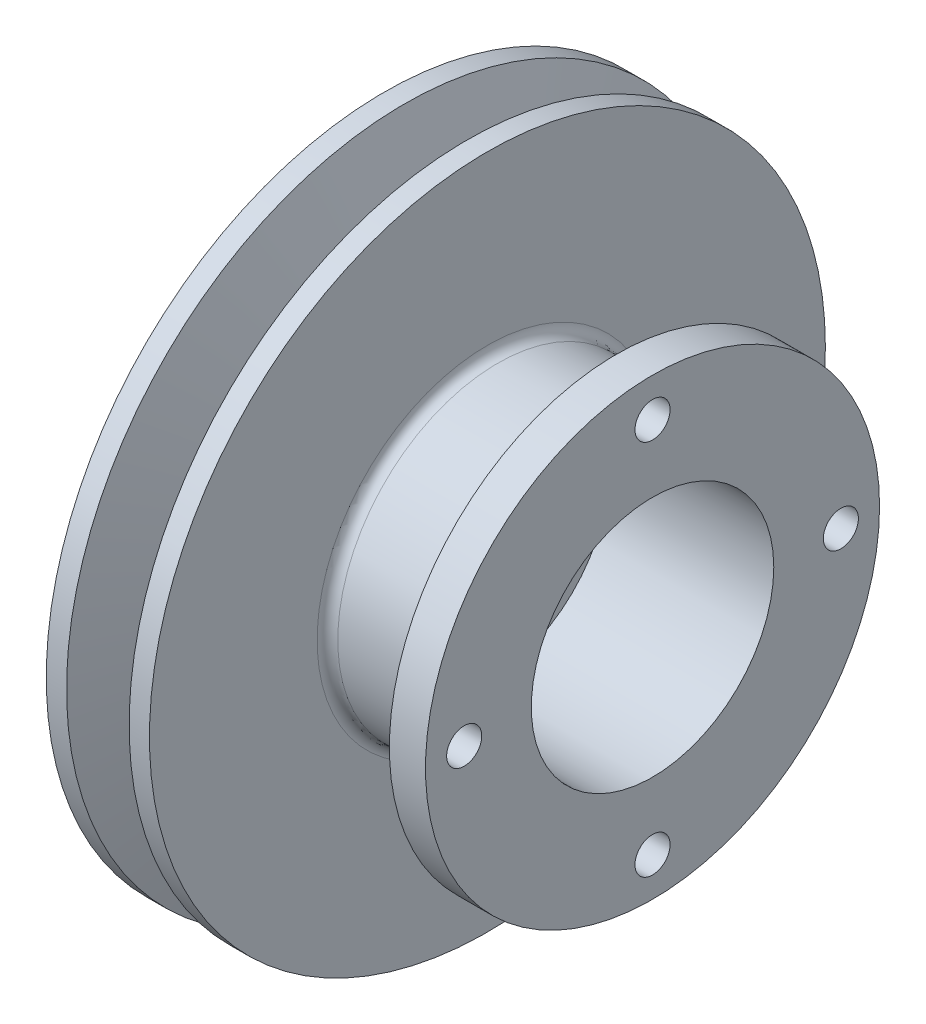
ISO-10303-21;
HEADER;
FILE_DESCRIPTION(('STEP AP214'),'2;1');
FILE_NAME('part.step','',(''),(''),'','','');
FILE_SCHEMA(('AUTOMOTIVE_DESIGN { 1 0 10303 214 1 1 1 1 }'));
ENDSEC;
DATA;
#1=APPLICATION_CONTEXT('core data for automotive mechanical design processes');
#2=APPLICATION_PROTOCOL_DEFINITION('international standard','automotive_design',2000,#1);
#3=PRODUCT_CONTEXT('',#1,'mechanical');
#4=PRODUCT('Part','Part','',(#3));
#5=PRODUCT_RELATED_PRODUCT_CATEGORY('part','',(#4));
#6=PRODUCT_DEFINITION_FORMATION('','',#4);
#7=PRODUCT_DEFINITION_CONTEXT('part definition',#1,'design');
#8=PRODUCT_DEFINITION('design','',#6,#7);
#9=PRODUCT_DEFINITION_SHAPE('','',#8);
#10=(LENGTH_UNIT() NAMED_UNIT(*) SI_UNIT(.MILLI.,.METRE.));
#11=(NAMED_UNIT(*) PLANE_ANGLE_UNIT() SI_UNIT($,.RADIAN.));
#12=(NAMED_UNIT(*) SI_UNIT($,.STERADIAN.) SOLID_ANGLE_UNIT());
#13=UNCERTAINTY_MEASURE_WITH_UNIT(LENGTH_MEASURE(1.E-05),#10,'distance_accuracy_value','');
#14=(GEOMETRIC_REPRESENTATION_CONTEXT(3) GLOBAL_UNCERTAINTY_ASSIGNED_CONTEXT((#13)) GLOBAL_UNIT_ASSIGNED_CONTEXT((#10,
#11,#12)) REPRESENTATION_CONTEXT('',''));
#15=CARTESIAN_POINT('',(0.,0.,0.));
#16=DIRECTION('',(0.,0.,1.));
#17=DIRECTION('',(1.,0.,0.));
#18=AXIS2_PLACEMENT_3D('',#15,#16,#17);
#19=CARTESIAN_POINT('',(-7.00000000000017,44.,0.));
#20=DIRECTION('',(-1.,0.,0.));
#21=DIRECTION('',(0.,0.,1.));
#22=AXIS2_PLACEMENT_3D('',#19,#20,#21);
#23=PLANE('',#22);
#24=CARTESIAN_POINT('',(-7.00000000000001,-36.5000000000001,0.));
#25=DIRECTION('',(-1.,0.,0.));
#26=DIRECTION('',(0.,0.,1.));
#27=AXIS2_PLACEMENT_3D('',#24,#25,#26);
#28=CIRCLE('',#27,3.4);
#29=CARTESIAN_POINT('',(-7.00000000000001,-36.5000000000001,3.40000000000007));
#30=VERTEX_POINT('',#29);
#31=EDGE_CURVE('E199',#30,#30,#28,.F.);
#32=ORIENTED_EDGE('',*,*,#31,.T.);
#33=EDGE_LOOP('',(#32));
#34=FACE_BOUND('',#33,.T.);
#35=CARTESIAN_POINT('',(-7.00000000000001,-1.31838984174237E-13,36.5));
#36=DIRECTION('',(-1.,0.,0.));
#37=DIRECTION('',(0.,0.,1.));
#38=AXIS2_PLACEMENT_3D('',#35,#36,#37);
#39=CIRCLE('',#38,3.39999999999999);
#40=CARTESIAN_POINT('',(-7.00000000000001,-1.31838984174237E-13,39.9));
#41=VERTEX_POINT('',#40);
#42=EDGE_CURVE('E191',#41,#41,#39,.F.);
#43=ORIENTED_EDGE('',*,*,#42,.T.);
#44=EDGE_LOOP('',(#43));
#45=FACE_BOUND('',#44,.T.);
#46=CARTESIAN_POINT('',(-7.00000000000001,0.,1.11022302462516E-13));
#47=DIRECTION('',(1.,0.,0.));
#48=DIRECTION('',(0.,0.,-1.));
#49=AXIS2_PLACEMENT_3D('',#46,#47,#48);
#50=CIRCLE('',#49,44.);
#51=CARTESIAN_POINT('',(-7.00000000000001,0.,-43.9999999999999));
#52=VERTEX_POINT('',#51);
#53=EDGE_CURVE('E113',#52,#52,#50,.T.);
#54=ORIENTED_EDGE('',*,*,#53,.F.);
#55=EDGE_LOOP('',(#54));
#56=FACE_BOUND('',#55,.T.);
#57=CARTESIAN_POINT('',(-7.00000000000001,0.,1.11022302462516E-13));
#58=DIRECTION('',(-1.,0.,0.));
#59=DIRECTION('',(0.,0.,1.));
#60=AXIS2_PLACEMENT_3D('',#57,#58,#59);
#61=CIRCLE('',#60,33.);
#62=CARTESIAN_POINT('',(-7.00000000000001,0.,33.0000000000001));
#63=VERTEX_POINT('',#62);
#64=EDGE_CURVE('E97',#63,#63,#61,.F.);
#65=ORIENTED_EDGE('',*,*,#64,.T.);
#66=EDGE_LOOP('',(#65));
#67=FACE_BOUND('',#66,.T.);
#68=CARTESIAN_POINT('',(-7.00000000000016,36.5,0.));
#69=DIRECTION('',(-1.,0.,0.));
#70=DIRECTION('',(0.,0.,1.));
#71=AXIS2_PLACEMENT_3D('',#68,#69,#70);
#72=CIRCLE('',#71,3.4);
#73=CARTESIAN_POINT('',(-7.00000000000016,36.5,3.40000000000002));
#74=VERTEX_POINT('',#73);
#75=EDGE_CURVE('E183',#74,#74,#72,.F.);
#76=ORIENTED_EDGE('',*,*,#75,.T.);
#77=EDGE_LOOP('',(#76));
#78=FACE_BOUND('',#77,.T.);
#79=CARTESIAN_POINT('',(-7.00000000000016,3.88578058618805E-13,-36.5));
#80=DIRECTION('',(-1.,0.,0.));
#81=DIRECTION('',(0.,0.,1.));
#82=AXIS2_PLACEMENT_3D('',#79,#80,#81);
#83=CIRCLE('',#82,3.39999999999999);
#84=CARTESIAN_POINT('',(-7.00000000000016,3.88578058618805E-13,-33.1));
#85=VERTEX_POINT('',#84);
#86=EDGE_CURVE('E207',#85,#85,#83,.F.);
#87=ORIENTED_EDGE('',*,*,#86,.T.);
#88=EDGE_LOOP('',(#87));
#89=FACE_BOUND('',#88,.T.);
#90=ADVANCED_FACE('F49',(#34,#45,#56,#67,#78,#89),#23,.T.);
#91=CARTESIAN_POINT('',(0.,0.,0.));
#92=DIRECTION('',(1.,0.,0.));
#93=DIRECTION('',(0.,0.,-1.));
#94=AXIS2_PLACEMENT_3D('',#91,#92,#93);
#95=PLANE('',#94);
#96=CARTESIAN_POINT('',(-1.52655665885959E-13,3.81639164714898E-13,-36.5));
#97=DIRECTION('',(1.,0.,0.));
#98=DIRECTION('',(0.,0.,-1.));
#99=AXIS2_PLACEMENT_3D('',#96,#97,#98);
#100=CIRCLE('',#99,3.39999999999999);
#101=CARTESIAN_POINT('',(-1.52655665885959E-13,3.81639164714898E-13,-39.9));
#102=VERTEX_POINT('',#101);
#103=EDGE_CURVE('E211',#102,#102,#100,.T.);
#104=ORIENTED_EDGE('',*,*,#103,.F.);
#105=EDGE_LOOP('',(#104));
#106=FACE_BOUND('',#105,.T.);
#107=CARTESIAN_POINT('',(0.,-36.5,0.));
#108=DIRECTION('',(1.,0.,0.));
#109=DIRECTION('',(0.,0.,-1.));
#110=AXIS2_PLACEMENT_3D('',#107,#108,#109);
#111=CIRCLE('',#110,3.39999999999999);
#112=CARTESIAN_POINT('',(0.,-36.5,-3.39999999999999));
#113=VERTEX_POINT('',#112);
#114=EDGE_CURVE('E203',#113,#113,#111,.T.);
#115=ORIENTED_EDGE('',*,*,#114,.F.);
#116=EDGE_LOOP('',(#115));
#117=FACE_BOUND('',#116,.T.);
#118=CARTESIAN_POINT('',(0.,-1.2490009027033E-13,36.5));
#119=DIRECTION('',(1.,0.,0.));
#120=DIRECTION('',(0.,0.,-1.));
#121=AXIS2_PLACEMENT_3D('',#118,#119,#120);
#122=CIRCLE('',#121,3.39999999999999);
#123=CARTESIAN_POINT('',(0.,-1.2490009027033E-13,33.1));
#124=VERTEX_POINT('',#123);
#125=EDGE_CURVE('E195',#124,#124,#122,.T.);
#126=ORIENTED_EDGE('',*,*,#125,.F.);
#127=EDGE_LOOP('',(#126));
#128=FACE_BOUND('',#127,.T.);
#129=CARTESIAN_POINT('',(-1.52655665885959E-13,36.5,0.));
#130=DIRECTION('',(1.,0.,0.));
#131=DIRECTION('',(0.,0.,-1.));
#132=AXIS2_PLACEMENT_3D('',#129,#130,#131);
#133=CIRCLE('',#132,3.39999999999999);
#134=CARTESIAN_POINT('',(-1.52655665885959E-13,36.5,-3.39999999999994));
#135=VERTEX_POINT('',#134);
#136=EDGE_CURVE('E187',#135,#135,#133,.T.);
#137=ORIENTED_EDGE('',*,*,#136,.F.);
#138=EDGE_LOOP('',(#137));
#139=FACE_BOUND('',#138,.T.);
#140=CARTESIAN_POINT('',(0.,0.,0.));
#141=DIRECTION('',(1.,0.,0.));
#142=DIRECTION('',(0.,0.,-1.));
#143=AXIS2_PLACEMENT_3D('',#140,#141,#142);
#144=CIRCLE('',#143,23.5);
#145=CARTESIAN_POINT('',(0.,0.,-23.5));
#146=VERTEX_POINT('',#145);
#147=EDGE_CURVE('E143',#146,#146,#144,.T.);
#148=ORIENTED_EDGE('',*,*,#147,.F.);
#149=EDGE_LOOP('',(#148));
#150=FACE_BOUND('',#149,.T.);
#151=CARTESIAN_POINT('',(0.,0.,0.));
#152=DIRECTION('',(1.,0.,0.));
#153=DIRECTION('',(0.,0.,-1.));
#154=AXIS2_PLACEMENT_3D('',#151,#152,#153);
#155=CIRCLE('',#154,44.);
#156=CARTESIAN_POINT('',(0.,0.,-44.));
#157=VERTEX_POINT('',#156);
#158=EDGE_CURVE('E109',#157,#157,#155,.T.);
#159=ORIENTED_EDGE('',*,*,#158,.T.);
#160=EDGE_LOOP('',(#159));
#161=FACE_BOUND('',#160,.T.);
#162=ADVANCED_FACE('F219',(#106,#117,#128,#139,#150,#161),#95,.T.);
#163=CARTESIAN_POINT('',(0.,0.,0.));
#164=DIRECTION('',(1.,0.,0.));
#165=DIRECTION('',(0.,0.,-1.));
#166=AXIS2_PLACEMENT_3D('',#163,#164,#165);
#167=CYLINDRICAL_SURFACE('',#166,44.);
#168=ORIENTED_EDGE('',*,*,#53,.T.);
#169=EDGE_LOOP('',(#168));
#170=FACE_BOUND('',#169,.T.);
#171=ORIENTED_EDGE('',*,*,#158,.F.);
#172=EDGE_LOOP('',(#171));
#173=FACE_BOUND('',#172,.T.);
#174=ADVANCED_FACE('F222',(#170,#173),#167,.T.);
#175=CARTESIAN_POINT('',(0.,0.,0.));
#176=DIRECTION('',(1.,0.,0.));
#177=DIRECTION('',(0.,0.,-1.));
#178=AXIS2_PLACEMENT_3D('',#175,#176,#177);
#179=CYLINDRICAL_SURFACE('',#178,31.);
#180=CARTESIAN_POINT('',(-8.99999999999999,0.,0.));
#181=DIRECTION('',(-1.,0.,0.));
#182=DIRECTION('',(0.,0.,1.));
#183=AXIS2_PLACEMENT_3D('',#180,#181,#182);
#184=CIRCLE('',#183,31.);
#185=CARTESIAN_POINT('',(-8.99999999999999,0.,31.));
#186=VERTEX_POINT('',#185);
#187=EDGE_CURVE('E89',#186,#186,#184,.T.);
#188=ORIENTED_EDGE('',*,*,#187,.T.);
#189=EDGE_LOOP('',(#188));
#190=FACE_BOUND('',#189,.T.);
#191=CARTESIAN_POINT('',(-30.0000000000001,0.,0.));
#192=DIRECTION('',(1.,0.,0.));
#193=DIRECTION('',(0.,0.,-1.));
#194=AXIS2_PLACEMENT_3D('',#191,#192,#193);
#195=CIRCLE('',#194,31.);
#196=CARTESIAN_POINT('',(-30.0000000000001,0.,-30.9999999999999));
#197=VERTEX_POINT('',#196);
#198=EDGE_CURVE('E93',#197,#197,#195,.T.);
#199=ORIENTED_EDGE('',*,*,#198,.T.);
#200=EDGE_LOOP('',(#199));
#201=FACE_BOUND('',#200,.T.);
#202=ADVANCED_FACE('F235',(#190,#201),#179,.T.);
#203=CARTESIAN_POINT('',(-32.0000000000001,31.,0.));
#204=DIRECTION('',(1.,0.,0.));
#205=DIRECTION('',(0.,0.,-1.));
#206=AXIS2_PLACEMENT_3D('',#203,#204,#205);
#207=PLANE('',#206);
#208=CARTESIAN_POINT('',(-32.0000000000001,0.,0.));
#209=DIRECTION('',(1.,0.,0.));
#210=DIRECTION('',(0.,0.,-1.));
#211=AXIS2_PLACEMENT_3D('',#208,#209,#210);
#212=CIRCLE('',#211,33.);
#213=CARTESIAN_POINT('',(-32.0000000000001,0.,-33.));
#214=VERTEX_POINT('',#213);
#215=EDGE_CURVE('E85',#214,#214,#212,.F.);
#216=ORIENTED_EDGE('',*,*,#215,.T.);
#217=EDGE_LOOP('',(#216));
#218=FACE_BOUND('',#217,.T.);
#219=CARTESIAN_POINT('',(-32.0000000000001,0.,0.));
#220=DIRECTION('',(1.,0.,0.));
#221=DIRECTION('',(0.,0.,-1.));
#222=AXIS2_PLACEMENT_3D('',#219,#220,#221);
#223=CIRCLE('',#222,65.5);
#224=CARTESIAN_POINT('',(-32.0000000000001,0.,-65.5));
#225=VERTEX_POINT('',#224);
#226=EDGE_CURVE('E116',#225,#225,#223,.T.);
#227=ORIENTED_EDGE('',*,*,#226,.T.);
#228=EDGE_LOOP('',(#227));
#229=FACE_BOUND('',#228,.T.);
#230=ADVANCED_FACE('F242',(#218,#229),#207,.T.);
#231=CARTESIAN_POINT('',(0.,0.,0.));
#232=DIRECTION('',(1.,0.,0.));
#233=DIRECTION('',(0.,0.,-1.));
#234=AXIS2_PLACEMENT_3D('',#231,#232,#233);
#235=CYLINDRICAL_SURFACE('',#234,65.5);
#236=CARTESIAN_POINT('',(-35.937861366952,0.,0.));
#237=DIRECTION('',(1.,0.,0.));
#238=DIRECTION('',(0.,0.,-1.));
#239=AXIS2_PLACEMENT_3D('',#236,#237,#238);
#240=CIRCLE('',#239,65.5);
#241=CARTESIAN_POINT('',(-35.937861366952,0.,-65.4999999999999));
#242=VERTEX_POINT('',#241);
#243=EDGE_CURVE('E119',#242,#242,#240,.T.);
#244=ORIENTED_EDGE('',*,*,#243,.T.);
#245=EDGE_LOOP('',(#244));
#246=FACE_BOUND('',#245,.T.);
#247=ORIENTED_EDGE('',*,*,#226,.F.);
#248=EDGE_LOOP('',(#247));
#249=FACE_BOUND('',#248,.T.);
#250=ADVANCED_FACE('F253',(#246,#249),#235,.T.);
#251=CARTESIAN_POINT('',(-35.937861366952,0.,0.));
#252=DIRECTION('',(1.,0.,0.));
#253=DIRECTION('',(0.,0.,-1.));
#254=AXIS2_PLACEMENT_3D('',#251,#252,#253);
#255=CONICAL_SURFACE('',#254,65.5,1.25663706143592);
#256=CARTESIAN_POINT('',(-39.9993575698633,0.,1.11022302462516E-13));
#257=DIRECTION('',(1.,0.,0.));
#258=DIRECTION('',(0.,0.,-1.));
#259=AXIS2_PLACEMENT_3D('',#256,#257,#258);
#260=CIRCLE('',#259,53.);
#261=CARTESIAN_POINT('',(-39.9993575698633,0.,-52.9999999999999));
#262=VERTEX_POINT('',#261);
#263=EDGE_CURVE('E123',#262,#262,#260,.T.);
#264=ORIENTED_EDGE('',*,*,#263,.T.);
#265=EDGE_LOOP('',(#264));
#266=FACE_BOUND('',#265,.T.);
#267=ORIENTED_EDGE('',*,*,#243,.F.);
#268=EDGE_LOOP('',(#267));
#269=FACE_BOUND('',#268,.T.);
#270=ADVANCED_FACE('F257',(#266,#269),#255,.T.);
#271=CARTESIAN_POINT('',(0.,0.,0.));
#272=DIRECTION('',(1.,0.,0.));
#273=DIRECTION('',(0.,0.,-1.));
#274=AXIS2_PLACEMENT_3D('',#271,#272,#273);
#275=CYLINDRICAL_SURFACE('',#274,53.);
#276=CARTESIAN_POINT('',(-44.0006424301369,0.,0.));
#277=DIRECTION('',(1.,0.,0.));
#278=DIRECTION('',(0.,0.,-1.));
#279=AXIS2_PLACEMENT_3D('',#276,#277,#278);
#280=CIRCLE('',#279,53.);
#281=CARTESIAN_POINT('',(-44.0006424301369,0.,-53.));
#282=VERTEX_POINT('',#281);
#283=EDGE_CURVE('E127',#282,#282,#280,.T.);
#284=ORIENTED_EDGE('',*,*,#283,.T.);
#285=EDGE_LOOP('',(#284));
#286=FACE_BOUND('',#285,.T.);
#287=ORIENTED_EDGE('',*,*,#263,.F.);
#288=EDGE_LOOP('',(#287));
#289=FACE_BOUND('',#288,.T.);
#290=ADVANCED_FACE('F261',(#286,#289),#275,.T.);
#291=CARTESIAN_POINT('',(-44.0006424301369,0.,0.));
#292=DIRECTION('',(-1.,0.,0.));
#293=DIRECTION('',(0.,0.,1.));
#294=AXIS2_PLACEMENT_3D('',#291,#292,#293);
#295=CONICAL_SURFACE('',#294,53.,1.25663706143592);
#296=CARTESIAN_POINT('',(-48.0621386330481,0.,0.));
#297=DIRECTION('',(1.,0.,0.));
#298=DIRECTION('',(0.,0.,-1.));
#299=AXIS2_PLACEMENT_3D('',#296,#297,#298);
#300=CIRCLE('',#299,65.5);
#301=CARTESIAN_POINT('',(-48.0621386330481,0.,-65.4999999999999));
#302=VERTEX_POINT('',#301);
#303=EDGE_CURVE('E131',#302,#302,#300,.T.);
#304=ORIENTED_EDGE('',*,*,#303,.T.);
#305=EDGE_LOOP('',(#304));
#306=FACE_BOUND('',#305,.T.);
#307=ORIENTED_EDGE('',*,*,#283,.F.);
#308=EDGE_LOOP('',(#307));
#309=FACE_BOUND('',#308,.T.);
#310=ADVANCED_FACE('F265',(#306,#309),#295,.T.);
#311=CARTESIAN_POINT('',(0.,0.,0.));
#312=DIRECTION('',(1.,0.,0.));
#313=DIRECTION('',(0.,0.,-1.));
#314=AXIS2_PLACEMENT_3D('',#311,#312,#313);
#315=CYLINDRICAL_SURFACE('',#314,65.5);
#316=CARTESIAN_POINT('',(-52.0000000000001,0.,0.));
#317=DIRECTION('',(1.,0.,0.));
#318=DIRECTION('',(0.,0.,-1.));
#319=AXIS2_PLACEMENT_3D('',#316,#317,#318);
#320=CIRCLE('',#319,65.5);
#321=CARTESIAN_POINT('',(-52.0000000000001,0.,-65.5));
#322=VERTEX_POINT('',#321);
#323=EDGE_CURVE('E135',#322,#322,#320,.T.);
#324=ORIENTED_EDGE('',*,*,#323,.T.);
#325=EDGE_LOOP('',(#324));
#326=FACE_BOUND('',#325,.T.);
#327=ORIENTED_EDGE('',*,*,#303,.F.);
#328=EDGE_LOOP('',(#327));
#329=FACE_BOUND('',#328,.T.);
#330=ADVANCED_FACE('F269',(#326,#329),#315,.T.);
#331=CARTESIAN_POINT('',(-52.,65.5,0.));
#332=DIRECTION('',(-1.,0.,0.));
#333=DIRECTION('',(0.,0.,1.));
#334=AXIS2_PLACEMENT_3D('',#331,#332,#333);
#335=PLANE('',#334);
#336=CARTESIAN_POINT('',(-52.0000000000001,0.,0.));
#337=DIRECTION('',(-1.,0.,0.));
#338=DIRECTION('',(0.,0.,1.));
#339=AXIS2_PLACEMENT_3D('',#336,#337,#338);
#340=CIRCLE('',#339,48.);
#341=CARTESIAN_POINT('',(-52.0000000000001,0.,48.));
#342=VERTEX_POINT('',#341);
#343=EDGE_CURVE('E81',#342,#342,#340,.F.);
#344=ORIENTED_EDGE('',*,*,#343,.T.);
#345=EDGE_LOOP('',(#344));
#346=FACE_BOUND('',#345,.T.);
#347=ORIENTED_EDGE('',*,*,#323,.F.);
#348=EDGE_LOOP('',(#347));
#349=FACE_BOUND('',#348,.T.);
#350=ADVANCED_FACE('F273',(#346,#349),#335,.T.);
#351=CARTESIAN_POINT('',(0.,0.,0.));
#352=DIRECTION('',(1.,0.,0.));
#353=DIRECTION('',(0.,0.,-1.));
#354=AXIS2_PLACEMENT_3D('',#351,#352,#353);
#355=CYLINDRICAL_SURFACE('',#354,46.);
#356=CARTESIAN_POINT('',(-50.0000000000001,0.,0.));
#357=DIRECTION('',(-1.,0.,0.));
#358=DIRECTION('',(0.,0.,1.));
#359=AXIS2_PLACEMENT_3D('',#356,#357,#358);
#360=CIRCLE('',#359,46.);
#361=CARTESIAN_POINT('',(-50.0000000000001,0.,46.0000000000001));
#362=VERTEX_POINT('',#361);
#363=EDGE_CURVE('E71',#362,#362,#360,.T.);
#364=ORIENTED_EDGE('',*,*,#363,.T.);
#365=EDGE_LOOP('',(#364));
#366=FACE_BOUND('',#365,.T.);
#367=CARTESIAN_POINT('',(-41.0000000000001,0.,0.));
#368=DIRECTION('',(-1.,0.,0.));
#369=DIRECTION('',(0.,0.,1.));
#370=AXIS2_PLACEMENT_3D('',#367,#368,#369);
#371=CIRCLE('',#370,46.);
#372=CARTESIAN_POINT('',(-41.0000000000001,0.,46.));
#373=VERTEX_POINT('',#372);
#374=EDGE_CURVE('E77',#373,#373,#371,.F.);
#375=ORIENTED_EDGE('',*,*,#374,.T.);
#376=EDGE_LOOP('',(#375));
#377=FACE_BOUND('',#376,.T.);
#378=ADVANCED_FACE('F277',(#366,#377),#355,.F.);
#379=CARTESIAN_POINT('',(-39.0000000000001,46.,0.));
#380=DIRECTION('',(-1.,0.,0.));
#381=DIRECTION('',(0.,0.,1.));
#382=AXIS2_PLACEMENT_3D('',#379,#380,#381);
#383=PLANE('',#382);
#384=CARTESIAN_POINT('',(-39.0000000000001,0.,0.));
#385=DIRECTION('',(-1.,0.,0.));
#386=DIRECTION('',(0.,0.,1.));
#387=AXIS2_PLACEMENT_3D('',#384,#385,#386);
#388=CIRCLE('',#387,40.);
#389=CARTESIAN_POINT('',(-39.0000000000001,0.,40.0000000000001));
#390=VERTEX_POINT('',#389);
#391=EDGE_CURVE('E57',#390,#390,#388,.F.);
#392=ORIENTED_EDGE('',*,*,#391,.T.);
#393=EDGE_LOOP('',(#392));
#394=FACE_BOUND('',#393,.T.);
#395=CARTESIAN_POINT('',(-39.0000000000001,0.,0.));
#396=DIRECTION('',(-1.,0.,0.));
#397=DIRECTION('',(0.,0.,1.));
#398=AXIS2_PLACEMENT_3D('',#395,#396,#397);
#399=CIRCLE('',#398,44.);
#400=CARTESIAN_POINT('',(-39.0000000000001,0.,44.0000000000001));
#401=VERTEX_POINT('',#400);
#402=EDGE_CURVE('E64',#401,#401,#399,.T.);
#403=ORIENTED_EDGE('',*,*,#402,.T.);
#404=EDGE_LOOP('',(#403));
#405=FACE_BOUND('',#404,.T.);
#406=ADVANCED_FACE('F281',(#394,#405),#383,.T.);
#407=CARTESIAN_POINT('',(0.,0.,0.));
#408=DIRECTION('',(1.,0.,0.));
#409=DIRECTION('',(0.,0.,-1.));
#410=AXIS2_PLACEMENT_3D('',#407,#408,#409);
#411=CYLINDRICAL_SURFACE('',#410,38.);
#412=CARTESIAN_POINT('',(-41.0000000000001,0.,0.));
#413=DIRECTION('',(-1.,0.,0.));
#414=DIRECTION('',(0.,0.,1.));
#415=AXIS2_PLACEMENT_3D('',#412,#413,#414);
#416=CIRCLE('',#415,38.);
#417=CARTESIAN_POINT('',(-41.0000000000001,0.,38.));
#418=VERTEX_POINT('',#417);
#419=EDGE_CURVE('E10',#418,#418,#416,.T.);
#420=ORIENTED_EDGE('',*,*,#419,.T.);
#421=EDGE_LOOP('',(#420));
#422=FACE_BOUND('',#421,.T.);
#423=CARTESIAN_POINT('',(-66.,0.,0.));
#424=DIRECTION('',(1.,0.,0.));
#425=DIRECTION('',(0.,0.,-1.));
#426=AXIS2_PLACEMENT_3D('',#423,#424,#425);
#427=CIRCLE('',#426,38.);
#428=CARTESIAN_POINT('',(-66.,0.,-37.9999999999999));
#429=VERTEX_POINT('',#428);
#430=EDGE_CURVE('E139',#429,#429,#427,.T.);
#431=ORIENTED_EDGE('',*,*,#430,.T.);
#432=EDGE_LOOP('',(#431));
#433=FACE_BOUND('',#432,.T.);
#434=ADVANCED_FACE('F285',(#422,#433),#411,.T.);
#435=CARTESIAN_POINT('',(-66.0000000000002,38.,0.));
#436=DIRECTION('',(-1.,0.,0.));
#437=DIRECTION('',(0.,0.,1.));
#438=AXIS2_PLACEMENT_3D('',#435,#436,#437);
#439=PLANE('',#438);
#440=CARTESIAN_POINT('',(-66.,0.,0.));
#441=DIRECTION('',(1.,0.,0.));
#442=DIRECTION('',(0.,0.,-1.));
#443=AXIS2_PLACEMENT_3D('',#440,#441,#442);
#444=CIRCLE('',#443,30.);
#445=CARTESIAN_POINT('',(-66.,0.,-29.9999999999999));
#446=VERTEX_POINT('',#445);
#447=EDGE_CURVE('E179',#446,#446,#444,.T.);
#448=ORIENTED_EDGE('',*,*,#447,.T.);
#449=EDGE_LOOP('',(#448));
#450=FACE_BOUND('',#449,.T.);
#451=ORIENTED_EDGE('',*,*,#430,.F.);
#452=EDGE_LOOP('',(#451));
#453=FACE_BOUND('',#452,.T.);
#454=ADVANCED_FACE('F288',(#450,#453),#439,.T.);
#455=CARTESIAN_POINT('',(0.,0.,0.));
#456=DIRECTION('',(1.,0.,0.));
#457=DIRECTION('',(0.,0.,-1.));
#458=AXIS2_PLACEMENT_3D('',#455,#456,#457);
#459=CYLINDRICAL_SURFACE('',#458,23.5);
#460=CARTESIAN_POINT('',(-32.0000000000001,0.,0.));
#461=DIRECTION('',(1.,0.,0.));
#462=DIRECTION('',(0.,0.,-1.));
#463=AXIS2_PLACEMENT_3D('',#460,#461,#462);
#464=CIRCLE('',#463,23.5);
#465=CARTESIAN_POINT('',(-32.0000000000001,0.,-23.5));
#466=VERTEX_POINT('',#465);
#467=EDGE_CURVE('E147',#466,#466,#464,.T.);
#468=ORIENTED_EDGE('',*,*,#467,.F.);
#469=EDGE_LOOP('',(#468));
#470=FACE_BOUND('',#469,.T.);
#471=ORIENTED_EDGE('',*,*,#147,.T.);
#472=EDGE_LOOP('',(#471));
#473=FACE_BOUND('',#472,.T.);
#474=ADVANCED_FACE('F291',(#470,#473),#459,.F.);
#475=CARTESIAN_POINT('',(-32.0000000000001,23.5,0.));
#476=DIRECTION('',(-1.,0.,0.));
#477=DIRECTION('',(0.,0.,1.));
#478=AXIS2_PLACEMENT_3D('',#475,#476,#477);
#479=PLANE('',#478);
#480=CARTESIAN_POINT('',(-32.0000000000001,0.,0.));
#481=DIRECTION('',(1.,0.,0.));
#482=DIRECTION('',(0.,0.,-1.));
#483=AXIS2_PLACEMENT_3D('',#480,#481,#482);
#484=CIRCLE('',#483,20.);
#485=CARTESIAN_POINT('',(-32.0000000000001,0.,-20.));
#486=VERTEX_POINT('',#485);
#487=EDGE_CURVE('E151',#486,#486,#484,.T.);
#488=ORIENTED_EDGE('',*,*,#487,.F.);
#489=EDGE_LOOP('',(#488));
#490=FACE_BOUND('',#489,.T.);
#491=ORIENTED_EDGE('',*,*,#467,.T.);
#492=EDGE_LOOP('',(#491));
#493=FACE_BOUND('',#492,.T.);
#494=ADVANCED_FACE('F295',(#490,#493),#479,.F.);
#495=CARTESIAN_POINT('',(0.,0.,0.));
#496=DIRECTION('',(1.,0.,0.));
#497=DIRECTION('',(0.,0.,-1.));
#498=AXIS2_PLACEMENT_3D('',#495,#496,#497);
#499=CYLINDRICAL_SURFACE('',#498,20.);
#500=CARTESIAN_POINT('',(-36.0000000000001,0.,0.));
#501=DIRECTION('',(1.,0.,0.));
#502=DIRECTION('',(0.,0.,-1.));
#503=AXIS2_PLACEMENT_3D('',#500,#501,#502);
#504=CIRCLE('',#503,20.);
#505=CARTESIAN_POINT('',(-36.0000000000001,0.,-19.9999999999999));
#506=VERTEX_POINT('',#505);
#507=EDGE_CURVE('E155',#506,#506,#504,.T.);
#508=ORIENTED_EDGE('',*,*,#507,.F.);
#509=EDGE_LOOP('',(#508));
#510=FACE_BOUND('',#509,.T.);
#511=ORIENTED_EDGE('',*,*,#487,.T.);
#512=EDGE_LOOP('',(#511));
#513=FACE_BOUND('',#512,.T.);
#514=ADVANCED_FACE('F299',(#510,#513),#499,.F.);
#515=CARTESIAN_POINT('',(-36.0000000000001,0.,0.));
#516=DIRECTION('',(-1.,0.,0.));
#517=DIRECTION('',(0.,0.,1.));
#518=AXIS2_PLACEMENT_3D('',#515,#516,#517);
#519=CONICAL_SURFACE('',#518,20.,0.785398163397449);
#520=CARTESIAN_POINT('',(-39.0000000000001,0.,0.));
#521=DIRECTION('',(1.,0.,0.));
#522=DIRECTION('',(0.,0.,-1.));
#523=AXIS2_PLACEMENT_3D('',#520,#521,#522);
#524=CIRCLE('',#523,23.);
#525=CARTESIAN_POINT('',(-39.0000000000001,0.,-22.9999999999999));
#526=VERTEX_POINT('',#525);
#527=EDGE_CURVE('E159',#526,#526,#524,.T.);
#528=ORIENTED_EDGE('',*,*,#527,.F.);
#529=EDGE_LOOP('',(#528));
#530=FACE_BOUND('',#529,.T.);
#531=ORIENTED_EDGE('',*,*,#507,.T.);
#532=EDGE_LOOP('',(#531));
#533=FACE_BOUND('',#532,.T.);
#534=ADVANCED_FACE('F303',(#530,#533),#519,.F.);
#535=CARTESIAN_POINT('',(-39.0000000000001,31.,0.));
#536=DIRECTION('',(1.,0.,0.));
#537=DIRECTION('',(0.,0.,-1.));
#538=AXIS2_PLACEMENT_3D('',#535,#536,#537);
#539=PLANE('',#538);
#540=CARTESIAN_POINT('',(-39.0000000000001,0.,0.));
#541=DIRECTION('',(1.,0.,0.));
#542=DIRECTION('',(0.,0.,-1.));
#543=AXIS2_PLACEMENT_3D('',#540,#541,#542);
#544=CIRCLE('',#543,31.);
#545=CARTESIAN_POINT('',(-39.0000000000001,0.,-30.9999999999999));
#546=VERTEX_POINT('',#545);
#547=EDGE_CURVE('E163',#546,#546,#544,.T.);
#548=ORIENTED_EDGE('',*,*,#547,.F.);
#549=EDGE_LOOP('',(#548));
#550=FACE_BOUND('',#549,.T.);
#551=ORIENTED_EDGE('',*,*,#527,.T.);
#552=EDGE_LOOP('',(#551));
#553=FACE_BOUND('',#552,.T.);
#554=ADVANCED_FACE('F307',(#550,#553),#539,.F.);
#555=CARTESIAN_POINT('',(0.,0.,0.));
#556=DIRECTION('',(1.,0.,0.));
#557=DIRECTION('',(0.,0.,-1.));
#558=AXIS2_PLACEMENT_3D('',#555,#556,#557);
#559=CYLINDRICAL_SURFACE('',#558,31.);
#560=CARTESIAN_POINT('',(-54.,0.,0.));
#561=DIRECTION('',(1.,0.,0.));
#562=DIRECTION('',(0.,0.,-1.));
#563=AXIS2_PLACEMENT_3D('',#560,#561,#562);
#564=CIRCLE('',#563,31.);
#565=CARTESIAN_POINT('',(-54.,0.,-31.));
#566=VERTEX_POINT('',#565);
#567=EDGE_CURVE('E101',#566,#566,#564,.F.);
#568=ORIENTED_EDGE('',*,*,#567,.T.);
#569=EDGE_LOOP('',(#568));
#570=FACE_BOUND('',#569,.T.);
#571=ORIENTED_EDGE('',*,*,#547,.T.);
#572=EDGE_LOOP('',(#571));
#573=FACE_BOUND('',#572,.T.);
#574=ADVANCED_FACE('F311',(#570,#573),#559,.F.);
#575=CARTESIAN_POINT('',(-55.,34.,0.));
#576=DIRECTION('',(1.,0.,0.));
#577=DIRECTION('',(0.,0.,-1.));
#578=AXIS2_PLACEMENT_3D('',#575,#576,#577);
#579=PLANE('',#578);
#580=CARTESIAN_POINT('',(-55.0000000000001,0.,0.));
#581=DIRECTION('',(1.,0.,0.));
#582=DIRECTION('',(0.,0.,-1.));
#583=AXIS2_PLACEMENT_3D('',#580,#581,#582);
#584=CIRCLE('',#583,32.);
#585=CARTESIAN_POINT('',(-55.0000000000001,0.,-32.));
#586=VERTEX_POINT('',#585);
#587=EDGE_CURVE('E105',#586,#586,#584,.T.);
#588=ORIENTED_EDGE('',*,*,#587,.T.);
#589=EDGE_LOOP('',(#588));
#590=FACE_BOUND('',#589,.T.);
#591=CARTESIAN_POINT('',(-55.0000000000001,0.,0.));
#592=DIRECTION('',(1.,0.,0.));
#593=DIRECTION('',(0.,0.,-1.));
#594=AXIS2_PLACEMENT_3D('',#591,#592,#593);
#595=CIRCLE('',#594,34.);
#596=CARTESIAN_POINT('',(-55.0000000000001,0.,-34.));
#597=VERTEX_POINT('',#596);
#598=EDGE_CURVE('E167',#597,#597,#595,.T.);
#599=ORIENTED_EDGE('',*,*,#598,.F.);
#600=EDGE_LOOP('',(#599));
#601=FACE_BOUND('',#600,.T.);
#602=ADVANCED_FACE('F315',(#590,#601),#579,.F.);
#603=CARTESIAN_POINT('',(0.,0.,0.));
#604=DIRECTION('',(1.,0.,0.));
#605=DIRECTION('',(0.,0.,-1.));
#606=AXIS2_PLACEMENT_3D('',#603,#604,#605);
#607=CYLINDRICAL_SURFACE('',#606,34.);
#608=CARTESIAN_POINT('',(-58.0000000000001,0.,0.));
#609=DIRECTION('',(1.,0.,0.));
#610=DIRECTION('',(0.,0.,-1.));
#611=AXIS2_PLACEMENT_3D('',#608,#609,#610);
#612=CIRCLE('',#611,34.);
#613=CARTESIAN_POINT('',(-58.0000000000001,0.,-34.));
#614=VERTEX_POINT('',#613);
#615=EDGE_CURVE('E171',#614,#614,#612,.T.);
#616=ORIENTED_EDGE('',*,*,#615,.F.);
#617=EDGE_LOOP('',(#616));
#618=FACE_BOUND('',#617,.T.);
#619=ORIENTED_EDGE('',*,*,#598,.T.);
#620=EDGE_LOOP('',(#619));
#621=FACE_BOUND('',#620,.T.);
#622=ADVANCED_FACE('F319',(#618,#621),#607,.F.);
#623=CARTESIAN_POINT('',(-58.,34.,0.));
#624=DIRECTION('',(-1.,0.,0.));
#625=DIRECTION('',(0.,0.,1.));
#626=AXIS2_PLACEMENT_3D('',#623,#624,#625);
#627=PLANE('',#626);
#628=CARTESIAN_POINT('',(-58.0000000000001,0.,0.));
#629=DIRECTION('',(1.,0.,0.));
#630=DIRECTION('',(0.,0.,-1.));
#631=AXIS2_PLACEMENT_3D('',#628,#629,#630);
#632=CIRCLE('',#631,30.);
#633=CARTESIAN_POINT('',(-58.0000000000001,0.,-30.));
#634=VERTEX_POINT('',#633);
#635=EDGE_CURVE('E175',#634,#634,#632,.T.);
#636=ORIENTED_EDGE('',*,*,#635,.F.);
#637=EDGE_LOOP('',(#636));
#638=FACE_BOUND('',#637,.T.);
#639=ORIENTED_EDGE('',*,*,#615,.T.);
#640=EDGE_LOOP('',(#639));
#641=FACE_BOUND('',#640,.T.);
#642=ADVANCED_FACE('F323',(#638,#641),#627,.F.);
#643=CARTESIAN_POINT('',(0.,0.,0.));
#644=DIRECTION('',(1.,0.,0.));
#645=DIRECTION('',(0.,0.,-1.));
#646=AXIS2_PLACEMENT_3D('',#643,#644,#645);
#647=CYLINDRICAL_SURFACE('',#646,30.);
#648=ORIENTED_EDGE('',*,*,#447,.F.);
#649=EDGE_LOOP('',(#648));
#650=FACE_BOUND('',#649,.T.);
#651=ORIENTED_EDGE('',*,*,#635,.T.);
#652=EDGE_LOOP('',(#651));
#653=FACE_BOUND('',#652,.T.);
#654=ADVANCED_FACE('F327',(#650,#653),#647,.F.);
#655=CARTESIAN_POINT('',(-55.0000000000001,0.,0.));
#656=DIRECTION('',(-1.,0.,0.));
#657=DIRECTION('',(0.,0.,1.));
#658=AXIS2_PLACEMENT_3D('',#655,#656,#657);
#659=CONICAL_SURFACE('',#658,32.,0.785398163397438);
#660=ORIENTED_EDGE('',*,*,#567,.F.);
#661=EDGE_LOOP('',(#660));
#662=FACE_BOUND('',#661,.T.);
#663=ORIENTED_EDGE('',*,*,#587,.F.);
#664=EDGE_LOOP('',(#663));
#665=FACE_BOUND('',#664,.T.);
#666=ADVANCED_FACE('F331',(#662,#665),#659,.F.);
#667=CARTESIAN_POINT('',(-8.99999999999999,0.,0.));
#668=DIRECTION('',(-1.,0.,0.));
#669=DIRECTION('',(0.,0.,1.));
#670=AXIS2_PLACEMENT_3D('',#667,#668,#669);
#671=TOROIDAL_SURFACE('',#670,33.,2.);
#672=ORIENTED_EDGE('',*,*,#187,.F.);
#673=EDGE_LOOP('',(#672));
#674=FACE_BOUND('',#673,.T.);
#675=ORIENTED_EDGE('',*,*,#64,.F.);
#676=EDGE_LOOP('',(#675));
#677=FACE_BOUND('',#676,.T.);
#678=ADVANCED_FACE('F395',(#674,#677),#671,.F.);
#679=CARTESIAN_POINT('',(-30.0000000000001,0.,0.));
#680=DIRECTION('',(1.,0.,0.));
#681=DIRECTION('',(0.,0.,-1.));
#682=AXIS2_PLACEMENT_3D('',#679,#680,#681);
#683=TOROIDAL_SURFACE('',#682,33.,2.);
#684=ORIENTED_EDGE('',*,*,#215,.F.);
#685=EDGE_LOOP('',(#684));
#686=FACE_BOUND('',#685,.T.);
#687=ORIENTED_EDGE('',*,*,#198,.F.);
#688=EDGE_LOOP('',(#687));
#689=FACE_BOUND('',#688,.T.);
#690=ADVANCED_FACE('F387',(#686,#689),#683,.F.);
#691=CARTESIAN_POINT('',(-50.0000000000001,0.,0.));
#692=DIRECTION('',(-1.,0.,0.));
#693=DIRECTION('',(0.,0.,1.));
#694=AXIS2_PLACEMENT_3D('',#691,#692,#693);
#695=TOROIDAL_SURFACE('',#694,48.,2.);
#696=ORIENTED_EDGE('',*,*,#363,.F.);
#697=EDGE_LOOP('',(#696));
#698=FACE_BOUND('',#697,.T.);
#699=ORIENTED_EDGE('',*,*,#343,.F.);
#700=EDGE_LOOP('',(#699));
#701=FACE_BOUND('',#700,.T.);
#702=ADVANCED_FACE('F380',(#698,#701),#695,.T.);
#703=CARTESIAN_POINT('',(-41.0000000000001,0.,0.));
#704=DIRECTION('',(-1.,0.,0.));
#705=DIRECTION('',(0.,0.,1.));
#706=AXIS2_PLACEMENT_3D('',#703,#704,#705);
#707=TOROIDAL_SURFACE('',#706,40.,2.);
#708=ORIENTED_EDGE('',*,*,#419,.F.);
#709=EDGE_LOOP('',(#708));
#710=FACE_BOUND('',#709,.T.);
#711=ORIENTED_EDGE('',*,*,#391,.F.);
#712=EDGE_LOOP('',(#711));
#713=FACE_BOUND('',#712,.T.);
#714=ADVANCED_FACE('F372',(#710,#713),#707,.F.);
#715=CARTESIAN_POINT('',(-41.0000000000001,0.,0.));
#716=DIRECTION('',(-1.,0.,0.));
#717=DIRECTION('',(0.,0.,1.));
#718=AXIS2_PLACEMENT_3D('',#715,#716,#717);
#719=TOROIDAL_SURFACE('',#718,44.,2.);
#720=ORIENTED_EDGE('',*,*,#402,.F.);
#721=EDGE_LOOP('',(#720));
#722=FACE_BOUND('',#721,.T.);
#723=ORIENTED_EDGE('',*,*,#374,.F.);
#724=EDGE_LOOP('',(#723));
#725=FACE_BOUND('',#724,.T.);
#726=ADVANCED_FACE('F51',(#722,#725),#719,.F.);
#727=CARTESIAN_POINT('',(-1.66533453693773E-13,36.5,0.));
#728=DIRECTION('',(1.,0.,0.));
#729=DIRECTION('',(0.,0.,-1.));
#730=AXIS2_PLACEMENT_3D('',#727,#728,#729);
#731=CYLINDRICAL_SURFACE('',#730,3.4);
#732=ORIENTED_EDGE('',*,*,#75,.F.);
#733=EDGE_LOOP('',(#732));
#734=FACE_BOUND('',#733,.T.);
#735=ORIENTED_EDGE('',*,*,#136,.T.);
#736=EDGE_LOOP('',(#735));
#737=FACE_BOUND('',#736,.T.);
#738=ADVANCED_FACE('F333',(#734,#737),#731,.F.);
#739=CARTESIAN_POINT('',(0.,-1.2490009027033E-13,36.5));
#740=DIRECTION('',(1.,0.,0.));
#741=DIRECTION('',(0.,0.,-1.));
#742=AXIS2_PLACEMENT_3D('',#739,#740,#741);
#743=CYLINDRICAL_SURFACE('',#742,3.39999999999999);
#744=ORIENTED_EDGE('',*,*,#42,.F.);
#745=EDGE_LOOP('',(#744));
#746=FACE_BOUND('',#745,.T.);
#747=ORIENTED_EDGE('',*,*,#125,.T.);
#748=EDGE_LOOP('',(#747));
#749=FACE_BOUND('',#748,.T.);
#750=ADVANCED_FACE('F336',(#746,#749),#743,.F.);
#751=CARTESIAN_POINT('',(0.,-36.5,0.));
#752=DIRECTION('',(1.,0.,0.));
#753=DIRECTION('',(0.,0.,-1.));
#754=AXIS2_PLACEMENT_3D('',#751,#752,#753);
#755=CYLINDRICAL_SURFACE('',#754,3.4);
#756=ORIENTED_EDGE('',*,*,#31,.F.);
#757=EDGE_LOOP('',(#756));
#758=FACE_BOUND('',#757,.T.);
#759=ORIENTED_EDGE('',*,*,#114,.T.);
#760=EDGE_LOOP('',(#759));
#761=FACE_BOUND('',#760,.T.);
#762=ADVANCED_FACE('F340',(#758,#761),#755,.F.);
#763=CARTESIAN_POINT('',(-1.66533453693773E-13,3.81639164714898E-13,-36.5));
#764=DIRECTION('',(1.,0.,0.));
#765=DIRECTION('',(0.,0.,-1.));
#766=AXIS2_PLACEMENT_3D('',#763,#764,#765);
#767=CYLINDRICAL_SURFACE('',#766,3.39999999999999);
#768=ORIENTED_EDGE('',*,*,#86,.F.);
#769=EDGE_LOOP('',(#768));
#770=FACE_BOUND('',#769,.T.);
#771=ORIENTED_EDGE('',*,*,#103,.T.);
#772=EDGE_LOOP('',(#771));
#773=FACE_BOUND('',#772,.T.);
#774=ADVANCED_FACE('F217',(#770,#773),#767,.F.);
#775=CLOSED_SHELL('',(#90,#162,#174,#202,#230,#250,#270,#290,#310,#330,#350,#378,#406,#434,#454,
#474,#494,#514,#534,#554,#574,#602,#622,#642,#654,#666,#678,#690,#702,#714,#726,#738,#750,#762,#774));
#776=MANIFOLD_SOLID_BREP('B2',#775);
#777=ADVANCED_BREP_SHAPE_REPRESENTATION('',(#18,#776),#14);
#778=SHAPE_DEFINITION_REPRESENTATION(#9,#777);
ENDSEC;
END-ISO-10303-21;
